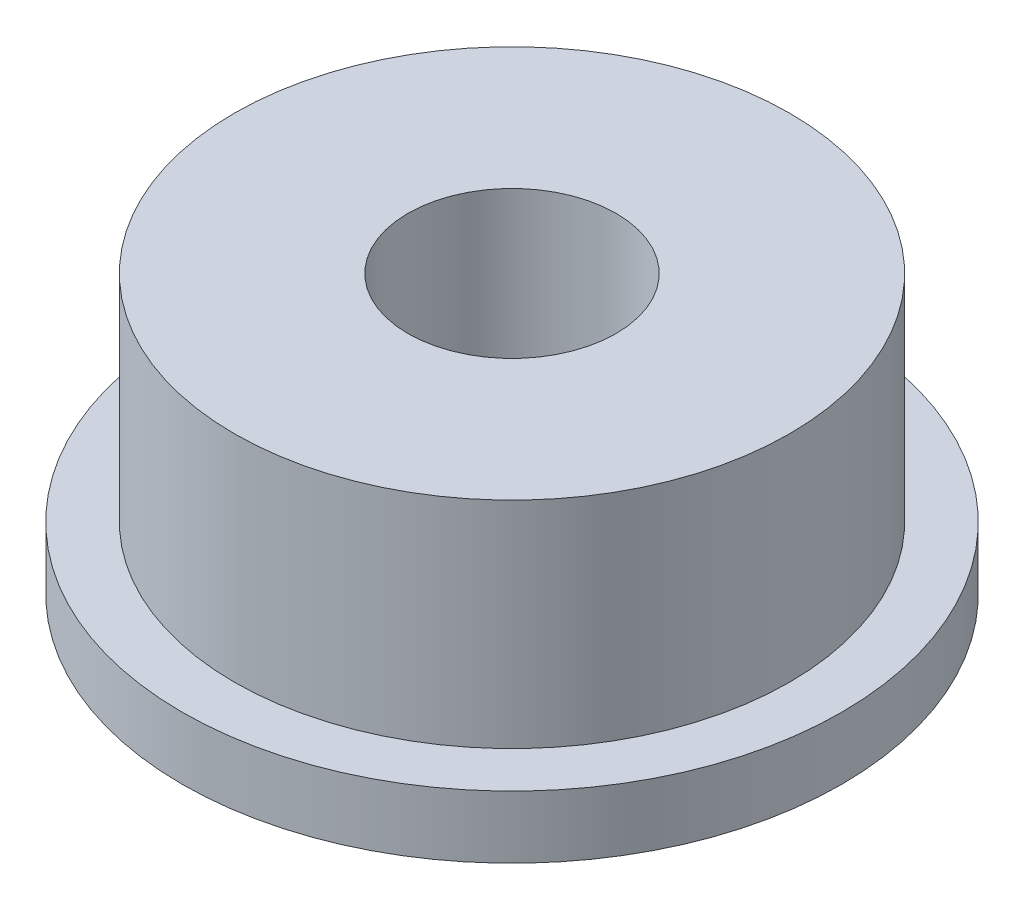
ISO-10303-21;
HEADER;
FILE_DESCRIPTION(('STEP AP214'),'2;1');
FILE_NAME('part.step','',(''),(''),'','','');
FILE_SCHEMA(('AUTOMOTIVE_DESIGN { 1 0 10303 214 1 1 1 1 }'));
ENDSEC;
DATA;
#1=APPLICATION_CONTEXT('core data for automotive mechanical design processes');
#2=APPLICATION_PROTOCOL_DEFINITION('international standard','automotive_design',2000,#1);
#3=PRODUCT_CONTEXT('',#1,'mechanical');
#4=PRODUCT('Part','Part','',(#3));
#5=PRODUCT_RELATED_PRODUCT_CATEGORY('part','',(#4));
#6=PRODUCT_DEFINITION_FORMATION('','',#4);
#7=PRODUCT_DEFINITION_CONTEXT('part definition',#1,'design');
#8=PRODUCT_DEFINITION('design','',#6,#7);
#9=PRODUCT_DEFINITION_SHAPE('','',#8);
#10=(LENGTH_UNIT() NAMED_UNIT(*) SI_UNIT(.MILLI.,.METRE.));
#11=(NAMED_UNIT(*) PLANE_ANGLE_UNIT() SI_UNIT($,.RADIAN.));
#12=(NAMED_UNIT(*) SI_UNIT($,.STERADIAN.) SOLID_ANGLE_UNIT());
#13=UNCERTAINTY_MEASURE_WITH_UNIT(LENGTH_MEASURE(1.E-05),#10,'distance_accuracy_value','');
#14=(GEOMETRIC_REPRESENTATION_CONTEXT(3) GLOBAL_UNCERTAINTY_ASSIGNED_CONTEXT((#13)) GLOBAL_UNIT_ASSIGNED_CONTEXT((#10,
#11,#12)) REPRESENTATION_CONTEXT('',''));
#15=CARTESIAN_POINT('',(0.,0.,0.));
#16=DIRECTION('',(0.,0.,1.));
#17=DIRECTION('',(1.,0.,0.));
#18=AXIS2_PLACEMENT_3D('',#15,#16,#17);
#19=CARTESIAN_POINT('',(0.,4.,0.));
#20=DIRECTION('',(0.,1.,0.));
#21=DIRECTION('',(0.,0.,1.));
#22=AXIS2_PLACEMENT_3D('',#19,#20,#21);
#23=CYLINDRICAL_SURFACE('',#22,1.5);
#24=CARTESIAN_POINT('',(0.,0.,0.));
#25=DIRECTION('',(0.,1.,0.));
#26=DIRECTION('',(0.,0.,1.));
#27=AXIS2_PLACEMENT_3D('',#24,#25,#26);
#28=CIRCLE('',#27,1.5);
#29=CARTESIAN_POINT('',(0.,0.,1.5));
#30=VERTEX_POINT('',#29);
#31=EDGE_CURVE('E10',#30,#30,#28,.T.);
#32=ORIENTED_EDGE('',*,*,#31,.F.);
#33=EDGE_LOOP('',(#32));
#34=FACE_BOUND('',#33,.T.);
#35=CARTESIAN_POINT('',(0.,4.,0.));
#36=DIRECTION('',(0.,1.,0.));
#37=DIRECTION('',(0.,0.,1.));
#38=AXIS2_PLACEMENT_3D('',#35,#36,#37);
#39=CIRCLE('',#38,1.5);
#40=CARTESIAN_POINT('',(0.,4.,1.5));
#41=VERTEX_POINT('',#40);
#42=EDGE_CURVE('E55',#41,#41,#39,.T.);
#43=ORIENTED_EDGE('',*,*,#42,.T.);
#44=EDGE_LOOP('',(#43));
#45=FACE_BOUND('',#44,.T.);
#46=ADVANCED_FACE('F33',(#34,#45),#23,.F.);
#47=CARTESIAN_POINT('',(1.5,0.,0.));
#48=DIRECTION('',(0.,1.,0.));
#49=DIRECTION('',(0.,0.,1.));
#50=AXIS2_PLACEMENT_3D('',#47,#48,#49);
#51=PLANE('',#50);
#52=CARTESIAN_POINT('',(0.,0.,0.));
#53=DIRECTION('',(0.,1.,0.));
#54=DIRECTION('',(0.,0.,1.));
#55=AXIS2_PLACEMENT_3D('',#52,#53,#54);
#56=CIRCLE('',#55,4.75);
#57=CARTESIAN_POINT('',(0.,0.,4.75));
#58=VERTEX_POINT('',#57);
#59=EDGE_CURVE('E39',#58,#58,#56,.T.);
#60=ORIENTED_EDGE('',*,*,#59,.F.);
#61=EDGE_LOOP('',(#60));
#62=FACE_BOUND('',#61,.T.);
#63=ORIENTED_EDGE('',*,*,#31,.T.);
#64=EDGE_LOOP('',(#63));
#65=FACE_BOUND('',#64,.T.);
#66=ADVANCED_FACE('F80',(#62,#65),#51,.F.);
#67=CARTESIAN_POINT('',(0.,4.,0.));
#68=DIRECTION('',(0.,1.,0.));
#69=DIRECTION('',(0.,0.,1.));
#70=AXIS2_PLACEMENT_3D('',#67,#68,#69);
#71=CYLINDRICAL_SURFACE('',#70,4.75);
#72=CARTESIAN_POINT('',(0.,0.9,0.));
#73=DIRECTION('',(0.,1.,0.));
#74=DIRECTION('',(0.,0.,1.));
#75=AXIS2_PLACEMENT_3D('',#72,#73,#74);
#76=CIRCLE('',#75,4.75);
#77=CARTESIAN_POINT('',(0.,0.9,4.75));
#78=VERTEX_POINT('',#77);
#79=EDGE_CURVE('E43',#78,#78,#76,.T.);
#80=ORIENTED_EDGE('',*,*,#79,.F.);
#81=EDGE_LOOP('',(#80));
#82=FACE_BOUND('',#81,.T.);
#83=ORIENTED_EDGE('',*,*,#59,.T.);
#84=EDGE_LOOP('',(#83));
#85=FACE_BOUND('',#84,.T.);
#86=ADVANCED_FACE('F75',(#82,#85),#71,.T.);
#87=CARTESIAN_POINT('',(4.75,0.9,0.));
#88=DIRECTION('',(0.,-1.,0.));
#89=DIRECTION('',(0.,0.,-1.));
#90=AXIS2_PLACEMENT_3D('',#87,#88,#89);
#91=PLANE('',#90);
#92=CARTESIAN_POINT('',(0.,0.9,0.));
#93=DIRECTION('',(0.,1.,0.));
#94=DIRECTION('',(0.,0.,1.));
#95=AXIS2_PLACEMENT_3D('',#92,#93,#94);
#96=CIRCLE('',#95,4.);
#97=CARTESIAN_POINT('',(0.,0.9,4.));
#98=VERTEX_POINT('',#97);
#99=EDGE_CURVE('E47',#98,#98,#96,.T.);
#100=ORIENTED_EDGE('',*,*,#99,.F.);
#101=EDGE_LOOP('',(#100));
#102=FACE_BOUND('',#101,.T.);
#103=ORIENTED_EDGE('',*,*,#79,.T.);
#104=EDGE_LOOP('',(#103));
#105=FACE_BOUND('',#104,.T.);
#106=ADVANCED_FACE('F69',(#102,#105),#91,.F.);
#107=CARTESIAN_POINT('',(0.,4.,0.));
#108=DIRECTION('',(0.,1.,0.));
#109=DIRECTION('',(0.,0.,1.));
#110=AXIS2_PLACEMENT_3D('',#107,#108,#109);
#111=CYLINDRICAL_SURFACE('',#110,4.);
#112=CARTESIAN_POINT('',(0.,4.,0.));
#113=DIRECTION('',(0.,1.,0.));
#114=DIRECTION('',(0.,0.,1.));
#115=AXIS2_PLACEMENT_3D('',#112,#113,#114);
#116=CIRCLE('',#115,4.);
#117=CARTESIAN_POINT('',(0.,4.,4.));
#118=VERTEX_POINT('',#117);
#119=EDGE_CURVE('E52',#118,#118,#116,.T.);
#120=ORIENTED_EDGE('',*,*,#119,.F.);
#121=EDGE_LOOP('',(#120));
#122=FACE_BOUND('',#121,.T.);
#123=ORIENTED_EDGE('',*,*,#99,.T.);
#124=EDGE_LOOP('',(#123));
#125=FACE_BOUND('',#124,.T.);
#126=ADVANCED_FACE('F63',(#122,#125),#111,.T.);
#127=CARTESIAN_POINT('',(4.,4.,0.));
#128=DIRECTION('',(0.,-1.,0.));
#129=DIRECTION('',(0.,0.,-1.));
#130=AXIS2_PLACEMENT_3D('',#127,#128,#129);
#131=PLANE('',#130);
#132=ORIENTED_EDGE('',*,*,#42,.F.);
#133=EDGE_LOOP('',(#132));
#134=FACE_BOUND('',#133,.T.);
#135=ORIENTED_EDGE('',*,*,#119,.T.);
#136=EDGE_LOOP('',(#135));
#137=FACE_BOUND('',#136,.T.);
#138=ADVANCED_FACE('F60',(#134,#137),#131,.F.);
#139=CLOSED_SHELL('',(#46,#66,#86,#106,#126,#138));
#140=MANIFOLD_SOLID_BREP('B2',#139);
#141=ADVANCED_BREP_SHAPE_REPRESENTATION('',(#18,#140),#14);
#142=SHAPE_DEFINITION_REPRESENTATION(#9,#141);
ENDSEC;
END-ISO-10303-21;
